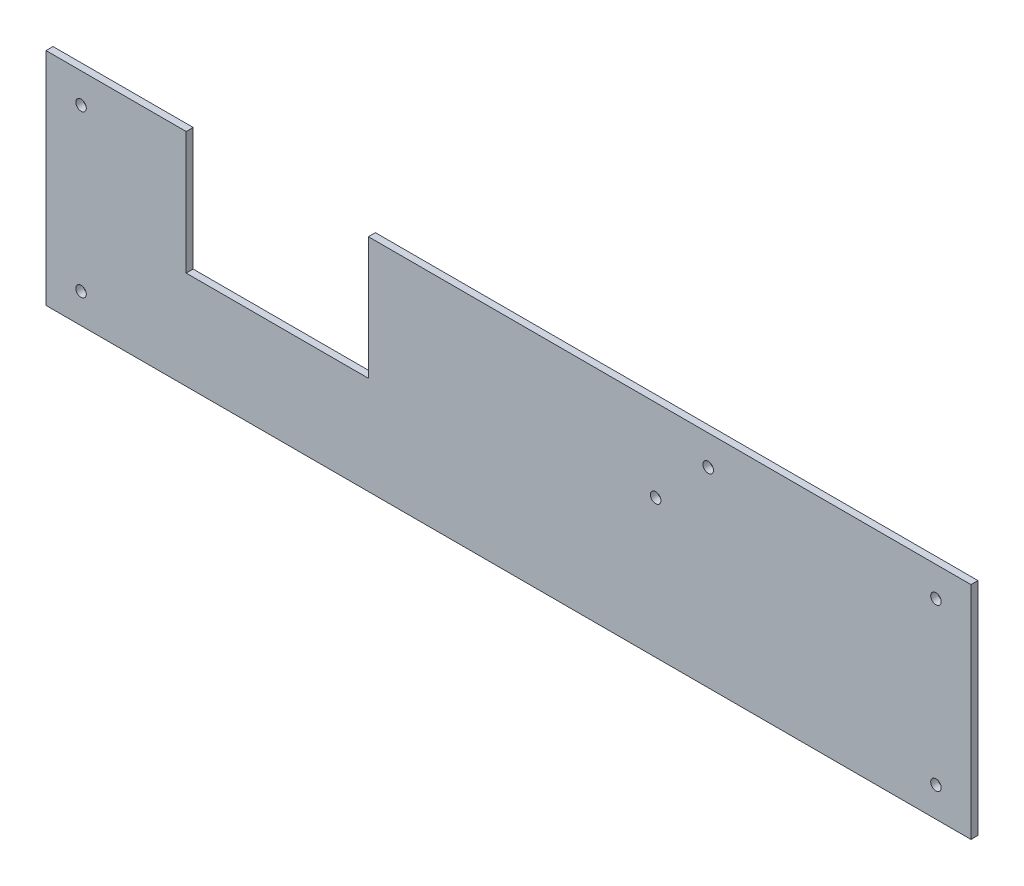
ISO-10303-21;
HEADER;
FILE_DESCRIPTION(('STEP AP214'),'2;1');
FILE_NAME('part.step','',(''),(''),'','','');
FILE_SCHEMA(('AUTOMOTIVE_DESIGN { 1 0 10303 214 1 1 1 1 }'));
ENDSEC;
DATA;
#1=APPLICATION_CONTEXT('core data for automotive mechanical design processes');
#2=APPLICATION_PROTOCOL_DEFINITION('international standard','automotive_design',2000,#1);
#3=PRODUCT_CONTEXT('',#1,'mechanical');
#4=PRODUCT('Part','Part','',(#3));
#5=PRODUCT_RELATED_PRODUCT_CATEGORY('part','',(#4));
#6=PRODUCT_DEFINITION_FORMATION('','',#4);
#7=PRODUCT_DEFINITION_CONTEXT('part definition',#1,'design');
#8=PRODUCT_DEFINITION('design','',#6,#7);
#9=PRODUCT_DEFINITION_SHAPE('','',#8);
#10=(LENGTH_UNIT() NAMED_UNIT(*) SI_UNIT(.MILLI.,.METRE.));
#11=(NAMED_UNIT(*) PLANE_ANGLE_UNIT() SI_UNIT($,.RADIAN.));
#12=(NAMED_UNIT(*) SI_UNIT($,.STERADIAN.) SOLID_ANGLE_UNIT());
#13=UNCERTAINTY_MEASURE_WITH_UNIT(LENGTH_MEASURE(1.E-05),#10,'distance_accuracy_value','');
#14=(GEOMETRIC_REPRESENTATION_CONTEXT(3) GLOBAL_UNCERTAINTY_ASSIGNED_CONTEXT((#13)) GLOBAL_UNIT_ASSIGNED_CONTEXT((#10,
#11,#12)) REPRESENTATION_CONTEXT('',''));
#15=CARTESIAN_POINT('',(0.,0.,0.));
#16=DIRECTION('',(0.,0.,1.));
#17=DIRECTION('',(1.,0.,0.));
#18=AXIS2_PLACEMENT_3D('',#15,#16,#17);
#19=CARTESIAN_POINT('',(-45.7386993125698,49.9081914893617,2.));
#20=DIRECTION('',(0.,-1.,0.));
#21=DIRECTION('',(0.,0.,-1.));
#22=AXIS2_PLACEMENT_3D('',#19,#20,#21);
#23=PLANE('',#22);
#24=DIRECTION('',(-1.,0.,0.));
#25=VECTOR('',#24,1.);
#26=CARTESIAN_POINT('',(-45.7386993125698,49.9081914893617,2.));
#27=LINE('',#26,#25);
#28=CARTESIAN_POINT('',(-5.73869931256985,49.9081914893617,2.));
#29=VERTEX_POINT('',#28);
#30=CARTESIAN_POINT('',(-45.7386993125698,49.9081914893617,2.));
#31=VERTEX_POINT('',#30);
#32=EDGE_CURVE('E55',#29,#31,#27,.T.);
#33=ORIENTED_EDGE('',*,*,#32,.F.);
#34=DIRECTION('',(0.,0.,-1.));
#35=VECTOR('',#34,1.);
#36=CARTESIAN_POINT('',(-5.73869931256985,49.9081914893617,2.));
#37=LINE('',#36,#35);
#38=CARTESIAN_POINT('',(-5.73869931256985,49.9081914893617,0.));
#39=VERTEX_POINT('',#38);
#40=EDGE_CURVE('E39',#29,#39,#37,.T.);
#41=ORIENTED_EDGE('',*,*,#40,.T.);
#42=DIRECTION('',(-1.,0.,0.));
#43=VECTOR('',#42,1.);
#44=CARTESIAN_POINT('',(-45.7386993125698,49.9081914893617,0.));
#45=LINE('',#44,#43);
#46=CARTESIAN_POINT('',(-45.7386993125698,49.9081914893617,0.));
#47=VERTEX_POINT('',#46);
#48=EDGE_CURVE('E77',#39,#47,#45,.T.);
#49=ORIENTED_EDGE('',*,*,#48,.T.);
#50=DIRECTION('',(0.,0.,-1.));
#51=VECTOR('',#50,1.);
#52=CARTESIAN_POINT('',(-45.7386993125698,49.9081914893617,2.));
#53=LINE('',#52,#51);
#54=EDGE_CURVE('E173',#31,#47,#53,.T.);
#55=ORIENTED_EDGE('',*,*,#54,.F.);
#56=EDGE_LOOP('',(#33,#41,#49,#55));
#57=FACE_BOUND('',#56,.T.);
#58=ADVANCED_FACE('F31',(#57),#23,.F.);
#59=CARTESIAN_POINT('',(-45.7386993125698,-13.0918085106383,2.));
#60=DIRECTION('',(0.,0.,1.));
#61=DIRECTION('',(1.,0.,0.));
#62=AXIS2_PLACEMENT_3D('',#59,#60,#61);
#63=PLANE('',#62);
#64=DIRECTION('',(0.,-1.,0.));
#65=VECTOR('',#64,1.);
#66=CARTESIAN_POINT('',(-5.73869931256985,49.9081914893617,2.));
#67=LINE('',#66,#65);
#68=CARTESIAN_POINT('',(-5.73869931256985,14.9081914893617,2.));
#69=VERTEX_POINT('',#68);
#70=EDGE_CURVE('E117',#29,#69,#67,.T.);
#71=ORIENTED_EDGE('',*,*,#70,.F.);
#72=ORIENTED_EDGE('',*,*,#32,.T.);
#73=DIRECTION('',(0.,-1.,0.));
#74=VECTOR('',#73,1.);
#75=CARTESIAN_POINT('',(-45.7386993125698,49.9081914893617,2.));
#76=LINE('',#75,#74);
#77=CARTESIAN_POINT('',(-45.7386993125698,-13.0918085106383,2.));
#78=VERTEX_POINT('',#77);
#79=EDGE_CURVE('E165',#31,#78,#76,.T.);
#80=ORIENTED_EDGE('',*,*,#79,.T.);
#81=DIRECTION('',(1.,0.,0.));
#82=VECTOR('',#81,1.);
#83=CARTESIAN_POINT('',(-45.7386993125698,-13.0918085106383,2.));
#84=LINE('',#83,#82);
#85=CARTESIAN_POINT('',(218.26130068743,-13.0918085106383,2.));
#86=VERTEX_POINT('',#85);
#87=EDGE_CURVE('E85',#78,#86,#84,.T.);
#88=ORIENTED_EDGE('',*,*,#87,.T.);
#89=DIRECTION('',(0.,1.,0.));
#90=VECTOR('',#89,1.);
#91=CARTESIAN_POINT('',(218.26130068743,49.9081914893617,2.));
#92=LINE('',#91,#90);
#93=CARTESIAN_POINT('',(218.26130068743,49.9081914893617,2.));
#94=VERTEX_POINT('',#93);
#95=EDGE_CURVE('E169',#86,#94,#92,.T.);
#96=ORIENTED_EDGE('',*,*,#95,.T.);
#97=CARTESIAN_POINT('',(46.2613006874302,49.9081914893617,2.));
#98=VERTEX_POINT('',#97);
#99=EDGE_CURVE('E171',#94,#98,#27,.T.);
#100=ORIENTED_EDGE('',*,*,#99,.T.);
#101=DIRECTION('',(0.,1.,0.));
#102=VECTOR('',#101,1.);
#103=CARTESIAN_POINT('',(46.2613006874302,49.9081914893617,2.));
#104=LINE('',#103,#102);
#105=CARTESIAN_POINT('',(46.2613006874302,14.9081914893617,2.));
#106=VERTEX_POINT('',#105);
#107=EDGE_CURVE('E46',#106,#98,#104,.T.);
#108=ORIENTED_EDGE('',*,*,#107,.F.);
#109=DIRECTION('',(1.,0.,0.));
#110=VECTOR('',#109,1.);
#111=CARTESIAN_POINT('',(-5.73869931256985,14.9081914893617,2.));
#112=LINE('',#111,#110);
#113=EDGE_CURVE('E112',#69,#106,#112,.T.);
#114=ORIENTED_EDGE('',*,*,#113,.F.);
#115=EDGE_LOOP('',(#71,#72,#80,#88,#96,#100,#108,#114));
#116=FACE_BOUND('',#115,.T.);
#117=CARTESIAN_POINT('',(128.26130068743,26.4081914893617,2.));
#118=DIRECTION('',(0.,0.,1.));
#119=DIRECTION('',(1.,0.,0.));
#120=AXIS2_PLACEMENT_3D('',#117,#118,#119);
#121=CIRCLE('',#120,1.5);
#122=CARTESIAN_POINT('',(129.76130068743,26.4081914893617,2.));
#123=VERTEX_POINT('',#122);
#124=EDGE_CURVE('E132',#123,#123,#121,.T.);
#125=ORIENTED_EDGE('',*,*,#124,.F.);
#126=EDGE_LOOP('',(#125));
#127=FACE_BOUND('',#126,.T.);
#128=CARTESIAN_POINT('',(143.26130068743,41.4081914893617,2.));
#129=DIRECTION('',(0.,0.,1.));
#130=DIRECTION('',(1.,0.,0.));
#131=AXIS2_PLACEMENT_3D('',#128,#129,#130);
#132=CIRCLE('',#131,1.5);
#133=CARTESIAN_POINT('',(144.76130068743,41.4081914893617,2.));
#134=VERTEX_POINT('',#133);
#135=EDGE_CURVE('E136',#134,#134,#132,.T.);
#136=ORIENTED_EDGE('',*,*,#135,.F.);
#137=EDGE_LOOP('',(#136));
#138=FACE_BOUND('',#137,.T.);
#139=CARTESIAN_POINT('',(208.26130068743,41.4081914893617,2.));
#140=DIRECTION('',(0.,0.,1.));
#141=DIRECTION('',(1.,0.,0.));
#142=AXIS2_PLACEMENT_3D('',#139,#140,#141);
#143=CIRCLE('',#142,1.5);
#144=CARTESIAN_POINT('',(209.76130068743,41.4081914893617,2.));
#145=VERTEX_POINT('',#144);
#146=EDGE_CURVE('E147',#145,#145,#143,.T.);
#147=ORIENTED_EDGE('',*,*,#146,.F.);
#148=EDGE_LOOP('',(#147));
#149=FACE_BOUND('',#148,.T.);
#150=CARTESIAN_POINT('',(-35.7386993125699,41.4081914893617,2.));
#151=DIRECTION('',(0.,0.,1.));
#152=DIRECTION('',(1.,0.,0.));
#153=AXIS2_PLACEMENT_3D('',#150,#151,#152);
#154=CIRCLE('',#153,1.5);
#155=CARTESIAN_POINT('',(-34.2386993125699,41.4081914893617,2.));
#156=VERTEX_POINT('',#155);
#157=EDGE_CURVE('E159',#156,#156,#154,.T.);
#158=ORIENTED_EDGE('',*,*,#157,.F.);
#159=EDGE_LOOP('',(#158));
#160=FACE_BOUND('',#159,.T.);
#161=CARTESIAN_POINT('',(-35.7386993125698,-4.59180851063831,2.));
#162=DIRECTION('',(0.,0.,1.));
#163=DIRECTION('',(1.,0.,0.));
#164=AXIS2_PLACEMENT_3D('',#161,#162,#163);
#165=CIRCLE('',#164,1.5);
#166=CARTESIAN_POINT('',(-34.2386993125698,-4.59180851063831,2.));
#167=VERTEX_POINT('',#166);
#168=EDGE_CURVE('E153',#167,#167,#165,.T.);
#169=ORIENTED_EDGE('',*,*,#168,.F.);
#170=EDGE_LOOP('',(#169));
#171=FACE_BOUND('',#170,.T.);
#172=CARTESIAN_POINT('',(208.26130068743,-4.59180851063831,2.));
#173=DIRECTION('',(0.,0.,1.));
#174=DIRECTION('',(1.,0.,0.));
#175=AXIS2_PLACEMENT_3D('',#172,#173,#174);
#176=CIRCLE('',#175,1.5);
#177=CARTESIAN_POINT('',(209.76130068743,-4.59180851063831,2.));
#178=VERTEX_POINT('',#177);
#179=EDGE_CURVE('E140',#178,#178,#176,.T.);
#180=ORIENTED_EDGE('',*,*,#179,.F.);
#181=EDGE_LOOP('',(#180));
#182=FACE_BOUND('',#181,.T.);
#183=ADVANCED_FACE('F120',(#116,#127,#138,#149,#160,#171,#182),#63,.T.);
#184=CARTESIAN_POINT('',(-45.7386993125698,-13.0918085106383,0.));
#185=DIRECTION('',(0.,0.,1.));
#186=DIRECTION('',(1.,0.,0.));
#187=AXIS2_PLACEMENT_3D('',#184,#185,#186);
#188=PLANE('',#187);
#189=ORIENTED_EDGE('',*,*,#48,.F.);
#190=DIRECTION('',(0.,-1.,0.));
#191=VECTOR('',#190,1.);
#192=CARTESIAN_POINT('',(-5.73869931256985,-13.0918085106383,0.));
#193=LINE('',#192,#191);
#194=CARTESIAN_POINT('',(-5.73869931256985,14.9081914893617,0.));
#195=VERTEX_POINT('',#194);
#196=EDGE_CURVE('E130',#39,#195,#193,.T.);
#197=ORIENTED_EDGE('',*,*,#196,.T.);
#198=DIRECTION('',(1.,0.,0.));
#199=VECTOR('',#198,1.);
#200=CARTESIAN_POINT('',(-45.7386993125698,14.9081914893617,0.));
#201=LINE('',#200,#199);
#202=CARTESIAN_POINT('',(46.2613006874302,14.9081914893617,0.));
#203=VERTEX_POINT('',#202);
#204=EDGE_CURVE('E11',#195,#203,#201,.T.);
#205=ORIENTED_EDGE('',*,*,#204,.T.);
#206=DIRECTION('',(0.,1.,0.));
#207=VECTOR('',#206,1.);
#208=CARTESIAN_POINT('',(46.2613006874302,-13.0918085106383,0.));
#209=LINE('',#208,#207);
#210=CARTESIAN_POINT('',(46.2613006874302,49.9081914893617,0.));
#211=VERTEX_POINT('',#210);
#212=EDGE_CURVE('E126',#203,#211,#209,.T.);
#213=ORIENTED_EDGE('',*,*,#212,.T.);
#214=CARTESIAN_POINT('',(218.26130068743,49.9081914893617,0.));
#215=VERTEX_POINT('',#214);
#216=EDGE_CURVE('E167',#215,#211,#45,.T.);
#217=ORIENTED_EDGE('',*,*,#216,.F.);
#218=DIRECTION('',(0.,1.,0.));
#219=VECTOR('',#218,1.);
#220=CARTESIAN_POINT('',(218.26130068743,49.9081914893617,0.));
#221=LINE('',#220,#219);
#222=CARTESIAN_POINT('',(218.26130068743,-13.0918085106383,0.));
#223=VERTEX_POINT('',#222);
#224=EDGE_CURVE('E178',#223,#215,#221,.T.);
#225=ORIENTED_EDGE('',*,*,#224,.F.);
#226=DIRECTION('',(1.,0.,0.));
#227=VECTOR('',#226,1.);
#228=CARTESIAN_POINT('',(-45.7386993125698,-13.0918085106383,0.));
#229=LINE('',#228,#227);
#230=CARTESIAN_POINT('',(-45.7386993125698,-13.0918085106383,0.));
#231=VERTEX_POINT('',#230);
#232=EDGE_CURVE('E176',#231,#223,#229,.T.);
#233=ORIENTED_EDGE('',*,*,#232,.F.);
#234=DIRECTION('',(0.,-1.,0.));
#235=VECTOR('',#234,1.);
#236=CARTESIAN_POINT('',(-45.7386993125698,49.9081914893617,0.));
#237=LINE('',#236,#235);
#238=EDGE_CURVE('E162',#47,#231,#237,.T.);
#239=ORIENTED_EDGE('',*,*,#238,.F.);
#240=EDGE_LOOP('',(#189,#197,#205,#213,#217,#225,#233,#239));
#241=FACE_BOUND('',#240,.T.);
#242=CARTESIAN_POINT('',(128.26130068743,26.4081914893617,0.));
#243=DIRECTION('',(0.,0.,1.));
#244=DIRECTION('',(1.,0.,0.));
#245=AXIS2_PLACEMENT_3D('',#242,#243,#244);
#246=CIRCLE('',#245,1.5);
#247=CARTESIAN_POINT('',(129.76130068743,26.4081914893617,0.));
#248=VERTEX_POINT('',#247);
#249=EDGE_CURVE('E135',#248,#248,#246,.T.);
#250=ORIENTED_EDGE('',*,*,#249,.T.);
#251=EDGE_LOOP('',(#250));
#252=FACE_BOUND('',#251,.T.);
#253=CARTESIAN_POINT('',(143.26130068743,41.4081914893617,0.));
#254=DIRECTION('',(0.,0.,1.));
#255=DIRECTION('',(1.,0.,0.));
#256=AXIS2_PLACEMENT_3D('',#253,#254,#255);
#257=CIRCLE('',#256,1.5);
#258=CARTESIAN_POINT('',(144.76130068743,41.4081914893617,0.));
#259=VERTEX_POINT('',#258);
#260=EDGE_CURVE('E139',#259,#259,#257,.T.);
#261=ORIENTED_EDGE('',*,*,#260,.T.);
#262=EDGE_LOOP('',(#261));
#263=FACE_BOUND('',#262,.T.);
#264=CARTESIAN_POINT('',(208.26130068743,41.4081914893617,0.));
#265=DIRECTION('',(0.,0.,1.));
#266=DIRECTION('',(1.,0.,0.));
#267=AXIS2_PLACEMENT_3D('',#264,#265,#266);
#268=CIRCLE('',#267,1.5);
#269=CARTESIAN_POINT('',(209.76130068743,41.4081914893617,0.));
#270=VERTEX_POINT('',#269);
#271=EDGE_CURVE('E143',#270,#270,#268,.T.);
#272=ORIENTED_EDGE('',*,*,#271,.T.);
#273=EDGE_LOOP('',(#272));
#274=FACE_BOUND('',#273,.T.);
#275=CARTESIAN_POINT('',(-35.7386993125699,41.4081914893617,0.));
#276=DIRECTION('',(0.,0.,1.));
#277=DIRECTION('',(1.,0.,0.));
#278=AXIS2_PLACEMENT_3D('',#275,#276,#277);
#279=CIRCLE('',#278,1.5);
#280=CARTESIAN_POINT('',(-34.2386993125699,41.4081914893617,0.));
#281=VERTEX_POINT('',#280);
#282=EDGE_CURVE('E156',#281,#281,#279,.T.);
#283=ORIENTED_EDGE('',*,*,#282,.T.);
#284=EDGE_LOOP('',(#283));
#285=FACE_BOUND('',#284,.T.);
#286=CARTESIAN_POINT('',(-35.7386993125698,-4.59180851063831,0.));
#287=DIRECTION('',(0.,0.,1.));
#288=DIRECTION('',(1.,0.,0.));
#289=AXIS2_PLACEMENT_3D('',#286,#287,#288);
#290=CIRCLE('',#289,1.5);
#291=CARTESIAN_POINT('',(-34.2386993125698,-4.59180851063831,0.));
#292=VERTEX_POINT('',#291);
#293=EDGE_CURVE('E150',#292,#292,#290,.T.);
#294=ORIENTED_EDGE('',*,*,#293,.T.);
#295=EDGE_LOOP('',(#294));
#296=FACE_BOUND('',#295,.T.);
#297=CARTESIAN_POINT('',(208.26130068743,-4.59180851063831,0.));
#298=DIRECTION('',(0.,0.,1.));
#299=DIRECTION('',(1.,0.,0.));
#300=AXIS2_PLACEMENT_3D('',#297,#298,#299);
#301=CIRCLE('',#300,1.5);
#302=CARTESIAN_POINT('',(209.76130068743,-4.59180851063831,0.));
#303=VERTEX_POINT('',#302);
#304=EDGE_CURVE('E144',#303,#303,#301,.T.);
#305=ORIENTED_EDGE('',*,*,#304,.T.);
#306=EDGE_LOOP('',(#305));
#307=FACE_BOUND('',#306,.T.);
#308=ADVANCED_FACE('F198',(#241,#252,#263,#274,#285,#296,#307),#188,.F.);
#309=CARTESIAN_POINT('',(-45.7386993125698,49.9081914893617,2.));
#310=DIRECTION('',(1.,0.,0.));
#311=DIRECTION('',(0.,0.,-1.));
#312=AXIS2_PLACEMENT_3D('',#309,#310,#311);
#313=PLANE('',#312);
#314=ORIENTED_EDGE('',*,*,#238,.T.);
#315=DIRECTION('',(0.,0.,-1.));
#316=VECTOR('',#315,1.);
#317=CARTESIAN_POINT('',(-45.7386993125698,-13.0918085106383,2.));
#318=LINE('',#317,#316);
#319=EDGE_CURVE('E189',#78,#231,#318,.T.);
#320=ORIENTED_EDGE('',*,*,#319,.F.);
#321=ORIENTED_EDGE('',*,*,#79,.F.);
#322=ORIENTED_EDGE('',*,*,#54,.T.);
#323=EDGE_LOOP('',(#314,#320,#321,#322));
#324=FACE_BOUND('',#323,.T.);
#325=ADVANCED_FACE('F33',(#324),#313,.F.);
#326=CARTESIAN_POINT('',(-45.7386993125698,-13.0918085106383,2.));
#327=DIRECTION('',(0.,1.,0.));
#328=DIRECTION('',(0.,0.,1.));
#329=AXIS2_PLACEMENT_3D('',#326,#327,#328);
#330=PLANE('',#329);
#331=ORIENTED_EDGE('',*,*,#232,.T.);
#332=DIRECTION('',(0.,0.,-1.));
#333=VECTOR('',#332,1.);
#334=CARTESIAN_POINT('',(218.26130068743,-13.0918085106383,2.));
#335=LINE('',#334,#333);
#336=EDGE_CURVE('E186',#86,#223,#335,.T.);
#337=ORIENTED_EDGE('',*,*,#336,.F.);
#338=ORIENTED_EDGE('',*,*,#87,.F.);
#339=ORIENTED_EDGE('',*,*,#319,.T.);
#340=EDGE_LOOP('',(#331,#337,#338,#339));
#341=FACE_BOUND('',#340,.T.);
#342=ADVANCED_FACE('F206',(#341),#330,.F.);
#343=CARTESIAN_POINT('',(218.26130068743,49.9081914893617,2.));
#344=DIRECTION('',(-1.,0.,0.));
#345=DIRECTION('',(0.,0.,1.));
#346=AXIS2_PLACEMENT_3D('',#343,#344,#345);
#347=PLANE('',#346);
#348=ORIENTED_EDGE('',*,*,#224,.T.);
#349=DIRECTION('',(0.,0.,-1.));
#350=VECTOR('',#349,1.);
#351=CARTESIAN_POINT('',(218.26130068743,49.9081914893617,2.));
#352=LINE('',#351,#350);
#353=EDGE_CURVE('E183',#94,#215,#352,.T.);
#354=ORIENTED_EDGE('',*,*,#353,.F.);
#355=ORIENTED_EDGE('',*,*,#95,.F.);
#356=ORIENTED_EDGE('',*,*,#336,.T.);
#357=EDGE_LOOP('',(#348,#354,#355,#356));
#358=FACE_BOUND('',#357,.T.);
#359=ADVANCED_FACE('F208',(#358),#347,.F.);
#360=ORIENTED_EDGE('',*,*,#216,.T.);
#361=DIRECTION('',(0.,0.,1.));
#362=VECTOR('',#361,1.);
#363=CARTESIAN_POINT('',(46.2613006874301,49.9081914893617,2.));
#364=LINE('',#363,#362);
#365=EDGE_CURVE('E191',#211,#98,#364,.T.);
#366=ORIENTED_EDGE('',*,*,#365,.T.);
#367=ORIENTED_EDGE('',*,*,#99,.F.);
#368=ORIENTED_EDGE('',*,*,#353,.T.);
#369=EDGE_LOOP('',(#360,#366,#367,#368));
#370=FACE_BOUND('',#369,.T.);
#371=ADVANCED_FACE('F212',(#370),#23,.F.);
#372=CARTESIAN_POINT('',(-35.7386993125699,41.4081914893617,2.));
#373=DIRECTION('',(0.,0.,-1.));
#374=DIRECTION('',(-1.,0.,0.));
#375=AXIS2_PLACEMENT_3D('',#372,#373,#374);
#376=CYLINDRICAL_SURFACE('',#375,1.5);
#377=ORIENTED_EDGE('',*,*,#157,.T.);
#378=EDGE_LOOP('',(#377));
#379=FACE_BOUND('',#378,.T.);
#380=ORIENTED_EDGE('',*,*,#282,.F.);
#381=EDGE_LOOP('',(#380));
#382=FACE_BOUND('',#381,.T.);
#383=ADVANCED_FACE('F231',(#379,#382),#376,.F.);
#384=CARTESIAN_POINT('',(-35.7386993125698,-4.59180851063831,2.));
#385=DIRECTION('',(0.,0.,-1.));
#386=DIRECTION('',(-1.,0.,0.));
#387=AXIS2_PLACEMENT_3D('',#384,#385,#386);
#388=CYLINDRICAL_SURFACE('',#387,1.5);
#389=ORIENTED_EDGE('',*,*,#168,.T.);
#390=EDGE_LOOP('',(#389));
#391=FACE_BOUND('',#390,.T.);
#392=ORIENTED_EDGE('',*,*,#293,.F.);
#393=EDGE_LOOP('',(#392));
#394=FACE_BOUND('',#393,.T.);
#395=ADVANCED_FACE('F237',(#391,#394),#388,.F.);
#396=CARTESIAN_POINT('',(208.26130068743,41.4081914893617,2.));
#397=DIRECTION('',(0.,0.,-1.));
#398=DIRECTION('',(-1.,0.,0.));
#399=AXIS2_PLACEMENT_3D('',#396,#397,#398);
#400=CYLINDRICAL_SURFACE('',#399,1.5);
#401=ORIENTED_EDGE('',*,*,#146,.T.);
#402=EDGE_LOOP('',(#401));
#403=FACE_BOUND('',#402,.T.);
#404=ORIENTED_EDGE('',*,*,#271,.F.);
#405=EDGE_LOOP('',(#404));
#406=FACE_BOUND('',#405,.T.);
#407=ADVANCED_FACE('F254',(#403,#406),#400,.F.);
#408=CARTESIAN_POINT('',(208.26130068743,-4.59180851063831,2.));
#409=DIRECTION('',(0.,0.,-1.));
#410=DIRECTION('',(-1.,0.,0.));
#411=AXIS2_PLACEMENT_3D('',#408,#409,#410);
#412=CYLINDRICAL_SURFACE('',#411,1.5);
#413=ORIENTED_EDGE('',*,*,#179,.T.);
#414=EDGE_LOOP('',(#413));
#415=FACE_BOUND('',#414,.T.);
#416=ORIENTED_EDGE('',*,*,#304,.F.);
#417=EDGE_LOOP('',(#416));
#418=FACE_BOUND('',#417,.T.);
#419=ADVANCED_FACE('F258',(#415,#418),#412,.F.);
#420=CARTESIAN_POINT('',(143.26130068743,41.4081914893617,-8.));
#421=DIRECTION('',(0.,0.,1.));
#422=DIRECTION('',(1.,0.,0.));
#423=AXIS2_PLACEMENT_3D('',#420,#421,#422);
#424=CYLINDRICAL_SURFACE('',#423,1.5);
#425=ORIENTED_EDGE('',*,*,#135,.T.);
#426=EDGE_LOOP('',(#425));
#427=FACE_BOUND('',#426,.T.);
#428=ORIENTED_EDGE('',*,*,#260,.F.);
#429=EDGE_LOOP('',(#428));
#430=FACE_BOUND('',#429,.T.);
#431=ADVANCED_FACE('F262',(#427,#430),#424,.F.);
#432=CARTESIAN_POINT('',(128.26130068743,26.4081914893617,-8.));
#433=DIRECTION('',(0.,0.,1.));
#434=DIRECTION('',(1.,0.,0.));
#435=AXIS2_PLACEMENT_3D('',#432,#433,#434);
#436=CYLINDRICAL_SURFACE('',#435,1.5);
#437=ORIENTED_EDGE('',*,*,#124,.T.);
#438=EDGE_LOOP('',(#437));
#439=FACE_BOUND('',#438,.T.);
#440=ORIENTED_EDGE('',*,*,#249,.F.);
#441=EDGE_LOOP('',(#440));
#442=FACE_BOUND('',#441,.T.);
#443=ADVANCED_FACE('F266',(#439,#442),#436,.F.);
#444=CARTESIAN_POINT('',(-5.73869931256985,14.9081914893617,-8.));
#445=DIRECTION('',(0.,-1.,0.));
#446=DIRECTION('',(0.,0.,-1.));
#447=AXIS2_PLACEMENT_3D('',#444,#445,#446);
#448=PLANE('',#447);
#449=DIRECTION('',(0.,0.,1.));
#450=VECTOR('',#449,1.);
#451=CARTESIAN_POINT('',(-5.73869931256985,14.9081914893617,-8.));
#452=LINE('',#451,#450);
#453=EDGE_CURVE('E107',#195,#69,#452,.T.);
#454=ORIENTED_EDGE('',*,*,#453,.T.);
#455=ORIENTED_EDGE('',*,*,#113,.T.);
#456=DIRECTION('',(0.,0.,1.));
#457=VECTOR('',#456,1.);
#458=CARTESIAN_POINT('',(46.2613006874302,14.9081914893617,-8.));
#459=LINE('',#458,#457);
#460=EDGE_CURVE('E115',#203,#106,#459,.T.);
#461=ORIENTED_EDGE('',*,*,#460,.F.);
#462=ORIENTED_EDGE('',*,*,#204,.F.);
#463=EDGE_LOOP('',(#454,#455,#461,#462));
#464=FACE_BOUND('',#463,.T.);
#465=ADVANCED_FACE('F109',(#464),#448,.F.);
#466=CARTESIAN_POINT('',(-5.73869931256985,49.9081914893617,-8.));
#467=DIRECTION('',(-1.,0.,0.));
#468=DIRECTION('',(0.,-1.,0.));
#469=AXIS2_PLACEMENT_3D('',#466,#467,#468);
#470=PLANE('',#469);
#471=ORIENTED_EDGE('',*,*,#40,.F.);
#472=ORIENTED_EDGE('',*,*,#70,.T.);
#473=ORIENTED_EDGE('',*,*,#453,.F.);
#474=ORIENTED_EDGE('',*,*,#196,.F.);
#475=EDGE_LOOP('',(#471,#472,#473,#474));
#476=FACE_BOUND('',#475,.T.);
#477=ADVANCED_FACE('F118',(#476),#470,.F.);
#478=CARTESIAN_POINT('',(46.2613006874302,49.9081914893617,-8.));
#479=DIRECTION('',(1.,0.,0.));
#480=DIRECTION('',(0.,1.,0.));
#481=AXIS2_PLACEMENT_3D('',#478,#479,#480);
#482=PLANE('',#481);
#483=ORIENTED_EDGE('',*,*,#460,.T.);
#484=ORIENTED_EDGE('',*,*,#107,.T.);
#485=ORIENTED_EDGE('',*,*,#365,.F.);
#486=ORIENTED_EDGE('',*,*,#212,.F.);
#487=EDGE_LOOP('',(#483,#484,#485,#486));
#488=FACE_BOUND('',#487,.T.);
#489=ADVANCED_FACE('F213',(#488),#482,.F.);
#490=CLOSED_SHELL('',(#58,#183,#308,#325,#342,#359,#371,#383,#395,#407,#419,#431,#443,#465,#477,#489));
#491=MANIFOLD_SOLID_BREP('B2',#490);
#492=ADVANCED_BREP_SHAPE_REPRESENTATION('',(#18,#491),#14);
#493=SHAPE_DEFINITION_REPRESENTATION(#9,#492);
ENDSEC;
END-ISO-10303-21;
